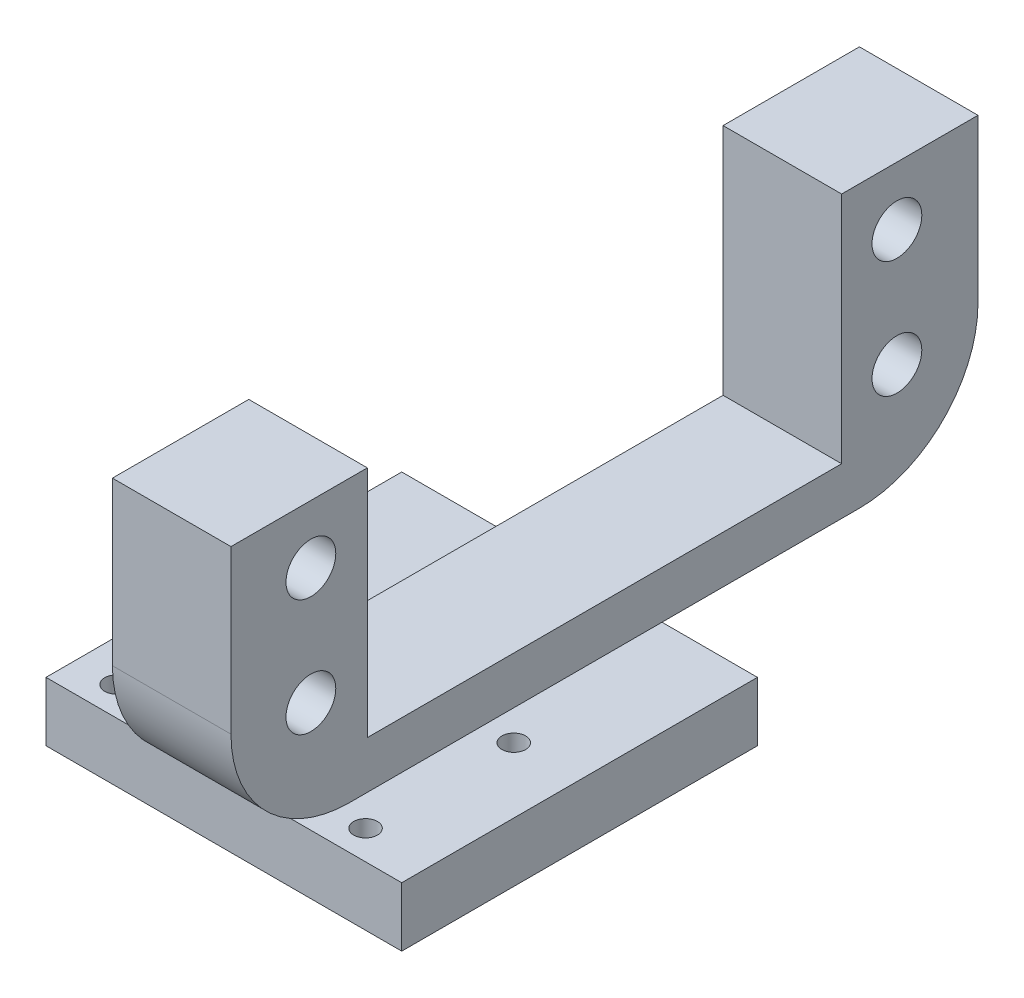
ISO-10303-21;
HEADER;
FILE_DESCRIPTION(('STEP AP214'),'2;1');
FILE_NAME('part.step','',(''),(''),'','','');
FILE_SCHEMA(('AUTOMOTIVE_DESIGN { 1 0 10303 214 1 1 1 1 }'));
ENDSEC;
DATA;
#1=APPLICATION_CONTEXT('core data for automotive mechanical design processes');
#2=APPLICATION_PROTOCOL_DEFINITION('international standard','automotive_design',2000,#1);
#3=PRODUCT_CONTEXT('',#1,'mechanical');
#4=PRODUCT('Part','Part','',(#3));
#5=PRODUCT_RELATED_PRODUCT_CATEGORY('part','',(#4));
#6=PRODUCT_DEFINITION_FORMATION('','',#4);
#7=PRODUCT_DEFINITION_CONTEXT('part definition',#1,'design');
#8=PRODUCT_DEFINITION('design','',#6,#7);
#9=PRODUCT_DEFINITION_SHAPE('','',#8);
#10=(LENGTH_UNIT() NAMED_UNIT(*) SI_UNIT(.MILLI.,.METRE.));
#11=(NAMED_UNIT(*) PLANE_ANGLE_UNIT() SI_UNIT($,.RADIAN.));
#12=(NAMED_UNIT(*) SI_UNIT($,.STERADIAN.) SOLID_ANGLE_UNIT());
#13=UNCERTAINTY_MEASURE_WITH_UNIT(LENGTH_MEASURE(1.E-05),#10,'distance_accuracy_value','');
#14=(GEOMETRIC_REPRESENTATION_CONTEXT(3) GLOBAL_UNCERTAINTY_ASSIGNED_CONTEXT((#13)) GLOBAL_UNIT_ASSIGNED_CONTEXT((#10,
#11,#12)) REPRESENTATION_CONTEXT('',''));
#15=CARTESIAN_POINT('',(0.,0.,0.));
#16=DIRECTION('',(0.,0.,1.));
#17=DIRECTION('',(1.,0.,0.));
#18=AXIS2_PLACEMENT_3D('',#15,#16,#17);
#19=CARTESIAN_POINT('',(10.,0.,0.));
#20=DIRECTION('',(0.,1.,0.));
#21=DIRECTION('',(0.,0.,1.));
#22=AXIS2_PLACEMENT_3D('',#19,#20,#21);
#23=PLANE('',#22);
#24=DIRECTION('',(1.,0.,0.));
#25=VECTOR('',#24,1.);
#26=CARTESIAN_POINT('',(18.0500000000001,0.,-36.35));
#27=LINE('',#26,#25);
#28=CARTESIAN_POINT('',(0.,0.,-36.35));
#29=VERTEX_POINT('',#28);
#30=CARTESIAN_POINT('',(10.,0.,-36.35));
#31=VERTEX_POINT('',#30);
#32=EDGE_CURVE('E59',#29,#31,#27,.T.);
#33=ORIENTED_EDGE('',*,*,#32,.F.);
#34=DIRECTION('',(0.,0.,-1.));
#35=VECTOR('',#34,1.);
#36=CARTESIAN_POINT('',(0.,0.,0.));
#37=LINE('',#36,#35);
#38=CARTESIAN_POINT('',(0.,0.,-53.));
#39=VERTEX_POINT('',#38);
#40=EDGE_CURVE('E221',#29,#39,#37,.T.);
#41=ORIENTED_EDGE('',*,*,#40,.T.);
#42=DIRECTION('',(-1.,0.,0.));
#43=VECTOR('',#42,1.);
#44=CARTESIAN_POINT('',(10.,0.,-53.));
#45=LINE('',#44,#43);
#46=CARTESIAN_POINT('',(10.,0.,-53.));
#47=VERTEX_POINT('',#46);
#48=EDGE_CURVE('E264',#39,#47,#45,.F.);
#49=ORIENTED_EDGE('',*,*,#48,.T.);
#50=DIRECTION('',(0.,0.,-1.));
#51=VECTOR('',#50,1.);
#52=CARTESIAN_POINT('',(10.,0.,0.));
#53=LINE('',#52,#51);
#54=EDGE_CURVE('E54',#31,#47,#53,.T.);
#55=ORIENTED_EDGE('',*,*,#54,.F.);
#56=EDGE_LOOP('',(#33,#41,#49,#55));
#57=FACE_BOUND('',#56,.T.);
#58=ADVANCED_FACE('F39',(#57),#23,.F.);
#59=CARTESIAN_POINT('',(10.,0.,0.));
#60=DIRECTION('',(0.,0.,-1.));
#61=DIRECTION('',(-1.,0.,0.));
#62=AXIS2_PLACEMENT_3D('',#59,#60,#61);
#63=PLANE('',#62);
#64=DIRECTION('',(0.,-1.,0.));
#65=VECTOR('',#64,1.);
#66=CARTESIAN_POINT('',(0.,0.,0.));
#67=LINE('',#66,#65);
#68=CARTESIAN_POINT('',(0.,23.7,0.));
#69=VERTEX_POINT('',#68);
#70=CARTESIAN_POINT('',(0.,10.,0.));
#71=VERTEX_POINT('',#70);
#72=EDGE_CURVE('E199',#69,#71,#67,.T.);
#73=ORIENTED_EDGE('',*,*,#72,.T.);
#74=DIRECTION('',(-1.,0.,0.));
#75=VECTOR('',#74,1.);
#76=CARTESIAN_POINT('',(10.,10.,0.));
#77=LINE('',#76,#75);
#78=CARTESIAN_POINT('',(10.,10.,0.));
#79=VERTEX_POINT('',#78);
#80=EDGE_CURVE('E11',#71,#79,#77,.F.);
#81=ORIENTED_EDGE('',*,*,#80,.T.);
#82=DIRECTION('',(0.,-1.,0.));
#83=VECTOR('',#82,1.);
#84=CARTESIAN_POINT('',(10.,0.,0.));
#85=LINE('',#84,#83);
#86=CARTESIAN_POINT('',(10.,23.7,0.));
#87=VERTEX_POINT('',#86);
#88=EDGE_CURVE('E200',#87,#79,#85,.T.);
#89=ORIENTED_EDGE('',*,*,#88,.F.);
#90=DIRECTION('',(-1.,0.,0.));
#91=VECTOR('',#90,1.);
#92=CARTESIAN_POINT('',(10.,23.7,0.));
#93=LINE('',#92,#91);
#94=EDGE_CURVE('E218',#87,#69,#93,.T.);
#95=ORIENTED_EDGE('',*,*,#94,.T.);
#96=EDGE_LOOP('',(#73,#81,#89,#95));
#97=FACE_BOUND('',#96,.T.);
#98=ADVANCED_FACE('F310',(#97),#63,.F.);
#99=CARTESIAN_POINT('',(10.,0.,-63.));
#100=DIRECTION('',(0.,0.,1.));
#101=DIRECTION('',(1.,0.,0.));
#102=AXIS2_PLACEMENT_3D('',#99,#100,#101);
#103=PLANE('',#102);
#104=DIRECTION('',(0.,1.,0.));
#105=VECTOR('',#104,1.);
#106=CARTESIAN_POINT('',(10.,0.,-63.));
#107=LINE('',#106,#105);
#108=CARTESIAN_POINT('',(10.,10.,-63.));
#109=VERTEX_POINT('',#108);
#110=CARTESIAN_POINT('',(10.,23.7,-63.));
#111=VERTEX_POINT('',#110);
#112=EDGE_CURVE('E206',#109,#111,#107,.T.);
#113=ORIENTED_EDGE('',*,*,#112,.F.);
#114=DIRECTION('',(-1.,0.,0.));
#115=VECTOR('',#114,1.);
#116=CARTESIAN_POINT('',(10.,10.,-63.));
#117=LINE('',#116,#115);
#118=CARTESIAN_POINT('',(0.,10.,-63.));
#119=VERTEX_POINT('',#118);
#120=EDGE_CURVE('E253',#109,#119,#117,.T.);
#121=ORIENTED_EDGE('',*,*,#120,.T.);
#122=DIRECTION('',(0.,1.,0.));
#123=VECTOR('',#122,1.);
#124=CARTESIAN_POINT('',(0.,0.,-63.));
#125=LINE('',#124,#123);
#126=CARTESIAN_POINT('',(0.,23.7,-63.));
#127=VERTEX_POINT('',#126);
#128=EDGE_CURVE('E225',#119,#127,#125,.T.);
#129=ORIENTED_EDGE('',*,*,#128,.T.);
#130=DIRECTION('',(-1.,0.,0.));
#131=VECTOR('',#130,1.);
#132=CARTESIAN_POINT('',(10.,23.7,-63.));
#133=LINE('',#132,#131);
#134=EDGE_CURVE('E250',#111,#127,#133,.T.);
#135=ORIENTED_EDGE('',*,*,#134,.F.);
#136=EDGE_LOOP('',(#113,#121,#129,#135));
#137=FACE_BOUND('',#136,.T.);
#138=ADVANCED_FACE('F276',(#137),#103,.F.);
#139=CARTESIAN_POINT('',(10.,23.7,-63.));
#140=DIRECTION('',(0.,-1.,0.));
#141=DIRECTION('',(0.,0.,-1.));
#142=AXIS2_PLACEMENT_3D('',#139,#140,#141);
#143=PLANE('',#142);
#144=DIRECTION('',(0.,0.,1.));
#145=VECTOR('',#144,1.);
#146=CARTESIAN_POINT('',(0.,23.7,-63.));
#147=LINE('',#146,#145);
#148=CARTESIAN_POINT('',(0.,23.7,-51.5));
#149=VERTEX_POINT('',#148);
#150=EDGE_CURVE('E227',#127,#149,#147,.T.);
#151=ORIENTED_EDGE('',*,*,#150,.T.);
#152=DIRECTION('',(-1.,0.,0.));
#153=VECTOR('',#152,1.);
#154=CARTESIAN_POINT('',(10.,23.7,-51.5));
#155=LINE('',#154,#153);
#156=CARTESIAN_POINT('',(10.,23.7,-51.5));
#157=VERTEX_POINT('',#156);
#158=EDGE_CURVE('E247',#157,#149,#155,.T.);
#159=ORIENTED_EDGE('',*,*,#158,.F.);
#160=DIRECTION('',(0.,0.,1.));
#161=VECTOR('',#160,1.);
#162=CARTESIAN_POINT('',(10.,23.7,-63.));
#163=LINE('',#162,#161);
#164=EDGE_CURVE('E208',#111,#157,#163,.T.);
#165=ORIENTED_EDGE('',*,*,#164,.F.);
#166=ORIENTED_EDGE('',*,*,#134,.T.);
#167=EDGE_LOOP('',(#151,#159,#165,#166));
#168=FACE_BOUND('',#167,.T.);
#169=ADVANCED_FACE('F285',(#168),#143,.F.);
#170=CARTESIAN_POINT('',(10.,23.7,-51.5));
#171=DIRECTION('',(0.,0.,-1.));
#172=DIRECTION('',(-1.,0.,0.));
#173=AXIS2_PLACEMENT_3D('',#170,#171,#172);
#174=PLANE('',#173);
#175=DIRECTION('',(0.,-1.,0.));
#176=VECTOR('',#175,1.);
#177=CARTESIAN_POINT('',(0.,23.7,-51.5));
#178=LINE('',#177,#176);
#179=CARTESIAN_POINT('',(0.,3.99999999999999,-51.5));
#180=VERTEX_POINT('',#179);
#181=EDGE_CURVE('E229',#149,#180,#178,.T.);
#182=ORIENTED_EDGE('',*,*,#181,.T.);
#183=DIRECTION('',(-1.,0.,0.));
#184=VECTOR('',#183,1.);
#185=CARTESIAN_POINT('',(10.,3.99999999999999,-51.5));
#186=LINE('',#185,#184);
#187=CARTESIAN_POINT('',(10.,3.99999999999999,-51.5));
#188=VERTEX_POINT('',#187);
#189=EDGE_CURVE('E244',#188,#180,#186,.T.);
#190=ORIENTED_EDGE('',*,*,#189,.F.);
#191=DIRECTION('',(0.,-1.,0.));
#192=VECTOR('',#191,1.);
#193=CARTESIAN_POINT('',(10.,23.7,-51.5));
#194=LINE('',#193,#192);
#195=EDGE_CURVE('E210',#157,#188,#194,.T.);
#196=ORIENTED_EDGE('',*,*,#195,.F.);
#197=ORIENTED_EDGE('',*,*,#158,.T.);
#198=EDGE_LOOP('',(#182,#190,#196,#197));
#199=FACE_BOUND('',#198,.T.);
#200=ADVANCED_FACE('F292',(#199),#174,.F.);
#201=CARTESIAN_POINT('',(10.,3.99999999999999,-51.5));
#202=DIRECTION('',(0.,-1.,0.));
#203=DIRECTION('',(0.,0.,-1.));
#204=AXIS2_PLACEMENT_3D('',#201,#202,#203);
#205=PLANE('',#204);
#206=DIRECTION('',(0.,0.,1.));
#207=VECTOR('',#206,1.);
#208=CARTESIAN_POINT('',(0.,3.99999999999999,-51.5));
#209=LINE('',#208,#207);
#210=CARTESIAN_POINT('',(0.,3.99999999999999,-11.5));
#211=VERTEX_POINT('',#210);
#212=EDGE_CURVE('E231',#180,#211,#209,.T.);
#213=ORIENTED_EDGE('',*,*,#212,.T.);
#214=DIRECTION('',(-1.,0.,0.));
#215=VECTOR('',#214,1.);
#216=CARTESIAN_POINT('',(10.,3.99999999999999,-11.5));
#217=LINE('',#216,#215);
#218=CARTESIAN_POINT('',(10.,3.99999999999999,-11.5));
#219=VERTEX_POINT('',#218);
#220=EDGE_CURVE('E241',#219,#211,#217,.T.);
#221=ORIENTED_EDGE('',*,*,#220,.F.);
#222=DIRECTION('',(0.,0.,1.));
#223=VECTOR('',#222,1.);
#224=CARTESIAN_POINT('',(10.,3.99999999999999,-51.5));
#225=LINE('',#224,#223);
#226=EDGE_CURVE('E212',#188,#219,#225,.T.);
#227=ORIENTED_EDGE('',*,*,#226,.F.);
#228=ORIENTED_EDGE('',*,*,#189,.T.);
#229=EDGE_LOOP('',(#213,#221,#227,#228));
#230=FACE_BOUND('',#229,.T.);
#231=ADVANCED_FACE('F295',(#230),#205,.F.);
#232=CARTESIAN_POINT('',(10.,23.7,-11.5));
#233=DIRECTION('',(0.,0.,1.));
#234=DIRECTION('',(1.,0.,0.));
#235=AXIS2_PLACEMENT_3D('',#232,#233,#234);
#236=PLANE('',#235);
#237=DIRECTION('',(0.,1.,0.));
#238=VECTOR('',#237,1.);
#239=CARTESIAN_POINT('',(0.,23.7,-11.5));
#240=LINE('',#239,#238);
#241=CARTESIAN_POINT('',(0.,23.7,-11.5));
#242=VERTEX_POINT('',#241);
#243=EDGE_CURVE('E233',#211,#242,#240,.T.);
#244=ORIENTED_EDGE('',*,*,#243,.T.);
#245=DIRECTION('',(-1.,0.,0.));
#246=VECTOR('',#245,1.);
#247=CARTESIAN_POINT('',(10.,23.7,-11.5));
#248=LINE('',#247,#246);
#249=CARTESIAN_POINT('',(10.,23.7,-11.5));
#250=VERTEX_POINT('',#249);
#251=EDGE_CURVE('E238',#250,#242,#248,.T.);
#252=ORIENTED_EDGE('',*,*,#251,.F.);
#253=DIRECTION('',(0.,1.,0.));
#254=VECTOR('',#253,1.);
#255=CARTESIAN_POINT('',(10.,23.7,-11.5));
#256=LINE('',#255,#254);
#257=EDGE_CURVE('E214',#219,#250,#256,.T.);
#258=ORIENTED_EDGE('',*,*,#257,.F.);
#259=ORIENTED_EDGE('',*,*,#220,.T.);
#260=EDGE_LOOP('',(#244,#252,#258,#259));
#261=FACE_BOUND('',#260,.T.);
#262=ADVANCED_FACE('F300',(#261),#236,.F.);
#263=CARTESIAN_POINT('',(10.,23.7,0.));
#264=DIRECTION('',(0.,-1.,0.));
#265=DIRECTION('',(0.,0.,-1.));
#266=AXIS2_PLACEMENT_3D('',#263,#264,#265);
#267=PLANE('',#266);
#268=DIRECTION('',(0.,0.,1.));
#269=VECTOR('',#268,1.);
#270=CARTESIAN_POINT('',(0.,23.7,0.));
#271=LINE('',#270,#269);
#272=EDGE_CURVE('E203',#242,#69,#271,.T.);
#273=ORIENTED_EDGE('',*,*,#272,.T.);
#274=ORIENTED_EDGE('',*,*,#94,.F.);
#275=DIRECTION('',(0.,0.,1.));
#276=VECTOR('',#275,1.);
#277=CARTESIAN_POINT('',(10.,23.7,0.));
#278=LINE('',#277,#276);
#279=EDGE_CURVE('E216',#250,#87,#278,.T.);
#280=ORIENTED_EDGE('',*,*,#279,.F.);
#281=ORIENTED_EDGE('',*,*,#251,.T.);
#282=EDGE_LOOP('',(#273,#274,#280,#281));
#283=FACE_BOUND('',#282,.T.);
#284=ADVANCED_FACE('F306',(#283),#267,.F.);
#285=CARTESIAN_POINT('',(10.,0.,0.));
#286=DIRECTION('',(-1.,0.,0.));
#287=DIRECTION('',(0.,0.,1.));
#288=AXIS2_PLACEMENT_3D('',#285,#286,#287);
#289=PLANE('',#288);
#290=CARTESIAN_POINT('',(10.,8.92500000000044,-6.73885438200013));
#291=DIRECTION('',(1.,0.,0.));
#292=DIRECTION('',(0.,0.,-1.));
#293=AXIS2_PLACEMENT_3D('',#290,#291,#292);
#294=CIRCLE('',#293,2.10000000000001);
#295=CARTESIAN_POINT('',(10.,8.92500000000044,-8.83885438200014));
#296=VERTEX_POINT('',#295);
#297=EDGE_CURVE('E170',#296,#296,#294,.T.);
#298=ORIENTED_EDGE('',*,*,#297,.F.);
#299=EDGE_LOOP('',(#298));
#300=FACE_BOUND('',#299,.T.);
#301=CARTESIAN_POINT('',(10.,8.92500000000028,-56.1611456180004));
#302=DIRECTION('',(1.,0.,0.));
#303=DIRECTION('',(0.,0.,-1.));
#304=AXIS2_PLACEMENT_3D('',#301,#302,#303);
#305=CIRCLE('',#304,2.10000000000001);
#306=CARTESIAN_POINT('',(10.,8.92500000000028,-58.2611456180004));
#307=VERTEX_POINT('',#306);
#308=EDGE_CURVE('E187',#307,#307,#305,.T.);
#309=ORIENTED_EDGE('',*,*,#308,.F.);
#310=EDGE_LOOP('',(#309));
#311=FACE_BOUND('',#310,.T.);
#312=CARTESIAN_POINT('',(10.,18.7750000000003,-56.1611456180005));
#313=DIRECTION('',(1.,0.,0.));
#314=DIRECTION('',(0.,0.,-1.));
#315=AXIS2_PLACEMENT_3D('',#312,#313,#314);
#316=CIRCLE('',#315,2.10000000000001);
#317=CARTESIAN_POINT('',(10.,18.7750000000003,-58.2611456180005));
#318=VERTEX_POINT('',#317);
#319=EDGE_CURVE('E179',#318,#318,#316,.T.);
#320=ORIENTED_EDGE('',*,*,#319,.F.);
#321=EDGE_LOOP('',(#320));
#322=FACE_BOUND('',#321,.T.);
#323=CARTESIAN_POINT('',(10.,18.7750000000004,-6.73885438200017));
#324=DIRECTION('',(1.,0.,0.));
#325=DIRECTION('',(0.,0.,-1.));
#326=AXIS2_PLACEMENT_3D('',#323,#324,#325);
#327=CIRCLE('',#326,2.10000000000001);
#328=CARTESIAN_POINT('',(10.,18.7750000000004,-8.83885438200018));
#329=VERTEX_POINT('',#328);
#330=EDGE_CURVE('E186',#329,#329,#327,.T.);
#331=ORIENTED_EDGE('',*,*,#330,.F.);
#332=EDGE_LOOP('',(#331));
#333=FACE_BOUND('',#332,.T.);
#334=CARTESIAN_POINT('',(10.,0.,-10.));
#335=VERTEX_POINT('',#334);
#336=EDGE_CURVE('E204',#335,#31,#53,.T.);
#337=ORIENTED_EDGE('',*,*,#336,.T.);
#338=ORIENTED_EDGE('',*,*,#54,.T.);
#339=CARTESIAN_POINT('',(10.,10.,-53.));
#340=DIRECTION('',(-1.,0.,0.));
#341=DIRECTION('',(0.,0.,1.));
#342=AXIS2_PLACEMENT_3D('',#339,#340,#341);
#343=CIRCLE('',#342,10.);
#344=EDGE_CURVE('E47',#47,#109,#343,.F.);
#345=ORIENTED_EDGE('',*,*,#344,.T.);
#346=ORIENTED_EDGE('',*,*,#112,.T.);
#347=ORIENTED_EDGE('',*,*,#164,.T.);
#348=ORIENTED_EDGE('',*,*,#195,.T.);
#349=ORIENTED_EDGE('',*,*,#226,.T.);
#350=ORIENTED_EDGE('',*,*,#257,.T.);
#351=ORIENTED_EDGE('',*,*,#279,.T.);
#352=ORIENTED_EDGE('',*,*,#88,.T.);
#353=CARTESIAN_POINT('',(10.,10.,-10.));
#354=DIRECTION('',(-1.,0.,0.));
#355=DIRECTION('',(0.,0.,1.));
#356=AXIS2_PLACEMENT_3D('',#353,#354,#355);
#357=CIRCLE('',#356,10.);
#358=EDGE_CURVE('E266',#79,#335,#357,.F.);
#359=ORIENTED_EDGE('',*,*,#358,.T.);
#360=EDGE_LOOP('',(#337,#338,#345,#346,#347,#348,#349,#350,#351,#352,#359));
#361=FACE_BOUND('',#360,.T.);
#362=ADVANCED_FACE('F270',(#300,#311,#322,#333,#361),#289,.F.);
#363=CARTESIAN_POINT('',(0.,0.,0.));
#364=DIRECTION('',(-1.,0.,0.));
#365=DIRECTION('',(0.,0.,1.));
#366=AXIS2_PLACEMENT_3D('',#363,#364,#365);
#367=PLANE('',#366);
#368=CARTESIAN_POINT('',(0.,8.92500000000044,-6.73885438200013));
#369=DIRECTION('',(-1.,0.,0.));
#370=DIRECTION('',(0.,0.,1.));
#371=AXIS2_PLACEMENT_3D('',#368,#369,#370);
#372=CIRCLE('',#371,2.10000000000001);
#373=CARTESIAN_POINT('',(0.,8.92500000000044,-4.63885438200012));
#374=VERTEX_POINT('',#373);
#375=EDGE_CURVE('E173',#374,#374,#372,.F.);
#376=ORIENTED_EDGE('',*,*,#375,.T.);
#377=EDGE_LOOP('',(#376));
#378=FACE_BOUND('',#377,.T.);
#379=CARTESIAN_POINT('',(0.,8.92500000000028,-56.1611456180004));
#380=DIRECTION('',(-1.,0.,0.));
#381=DIRECTION('',(0.,0.,1.));
#382=AXIS2_PLACEMENT_3D('',#379,#380,#381);
#383=CIRCLE('',#382,2.10000000000001);
#384=CARTESIAN_POINT('',(0.,8.92500000000028,-54.0611456180004));
#385=VERTEX_POINT('',#384);
#386=EDGE_CURVE('E183',#385,#385,#383,.F.);
#387=ORIENTED_EDGE('',*,*,#386,.T.);
#388=EDGE_LOOP('',(#387));
#389=FACE_BOUND('',#388,.T.);
#390=CARTESIAN_POINT('',(0.,18.7750000000003,-56.1611456180005));
#391=DIRECTION('',(-1.,0.,0.));
#392=DIRECTION('',(0.,0.,1.));
#393=AXIS2_PLACEMENT_3D('',#390,#391,#392);
#394=CIRCLE('',#393,2.10000000000001);
#395=CARTESIAN_POINT('',(0.,18.7750000000003,-54.0611456180005));
#396=VERTEX_POINT('',#395);
#397=EDGE_CURVE('E182',#396,#396,#394,.F.);
#398=ORIENTED_EDGE('',*,*,#397,.T.);
#399=EDGE_LOOP('',(#398));
#400=FACE_BOUND('',#399,.T.);
#401=CARTESIAN_POINT('',(0.,18.7750000000004,-6.73885438200017));
#402=DIRECTION('',(-1.,0.,0.));
#403=DIRECTION('',(0.,0.,1.));
#404=AXIS2_PLACEMENT_3D('',#401,#402,#403);
#405=CIRCLE('',#404,2.10000000000001);
#406=CARTESIAN_POINT('',(0.,18.7750000000004,-4.63885438200016));
#407=VERTEX_POINT('',#406);
#408=EDGE_CURVE('E196',#407,#407,#405,.F.);
#409=ORIENTED_EDGE('',*,*,#408,.T.);
#410=EDGE_LOOP('',(#409));
#411=FACE_BOUND('',#410,.T.);
#412=ORIENTED_EDGE('',*,*,#128,.F.);
#413=CARTESIAN_POINT('',(0.,10.,-53.));
#414=DIRECTION('',(-1.,0.,0.));
#415=DIRECTION('',(0.,0.,1.));
#416=AXIS2_PLACEMENT_3D('',#413,#414,#415);
#417=CIRCLE('',#416,10.);
#418=EDGE_CURVE('E258',#119,#39,#417,.T.);
#419=ORIENTED_EDGE('',*,*,#418,.T.);
#420=ORIENTED_EDGE('',*,*,#40,.F.);
#421=CARTESIAN_POINT('',(0.,0.,-10.));
#422=VERTEX_POINT('',#421);
#423=EDGE_CURVE('E222',#422,#29,#37,.T.);
#424=ORIENTED_EDGE('',*,*,#423,.F.);
#425=CARTESIAN_POINT('',(0.,10.,-10.));
#426=DIRECTION('',(-1.,0.,0.));
#427=DIRECTION('',(0.,0.,1.));
#428=AXIS2_PLACEMENT_3D('',#425,#426,#427);
#429=CIRCLE('',#428,10.);
#430=EDGE_CURVE('E256',#422,#71,#429,.T.);
#431=ORIENTED_EDGE('',*,*,#430,.T.);
#432=ORIENTED_EDGE('',*,*,#72,.F.);
#433=ORIENTED_EDGE('',*,*,#272,.F.);
#434=ORIENTED_EDGE('',*,*,#243,.F.);
#435=ORIENTED_EDGE('',*,*,#212,.F.);
#436=ORIENTED_EDGE('',*,*,#181,.F.);
#437=ORIENTED_EDGE('',*,*,#150,.F.);
#438=EDGE_LOOP('',(#412,#419,#420,#424,#431,#432,#433,#434,#435,#436,#437));
#439=FACE_BOUND('',#438,.T.);
#440=ADVANCED_FACE('F281',(#378,#389,#400,#411,#439),#367,.T.);
#441=CARTESIAN_POINT('',(-5.93969696196703,18.7750000000004,-6.73885438200017));
#442=DIRECTION('',(1.,0.,0.));
#443=DIRECTION('',(0.,0.,-1.));
#444=AXIS2_PLACEMENT_3D('',#441,#442,#443);
#445=CYLINDRICAL_SURFACE('',#444,2.10000000000001);
#446=ORIENTED_EDGE('',*,*,#330,.T.);
#447=EDGE_LOOP('',(#446));
#448=FACE_BOUND('',#447,.T.);
#449=ORIENTED_EDGE('',*,*,#408,.F.);
#450=EDGE_LOOP('',(#449));
#451=FACE_BOUND('',#450,.T.);
#452=ADVANCED_FACE('F382',(#448,#451),#445,.F.);
#453=CARTESIAN_POINT('',(-5.93969696196703,18.7750000000003,-56.1611456180005));
#454=DIRECTION('',(1.,0.,0.));
#455=DIRECTION('',(0.,0.,-1.));
#456=AXIS2_PLACEMENT_3D('',#453,#454,#455);
#457=CYLINDRICAL_SURFACE('',#456,2.10000000000001);
#458=ORIENTED_EDGE('',*,*,#319,.T.);
#459=EDGE_LOOP('',(#458));
#460=FACE_BOUND('',#459,.T.);
#461=ORIENTED_EDGE('',*,*,#397,.F.);
#462=EDGE_LOOP('',(#461));
#463=FACE_BOUND('',#462,.T.);
#464=ADVANCED_FACE('F376',(#460,#463),#457,.F.);
#465=CARTESIAN_POINT('',(-5.93969696196703,8.92500000000028,-56.1611456180004));
#466=DIRECTION('',(1.,0.,0.));
#467=DIRECTION('',(0.,0.,-1.));
#468=AXIS2_PLACEMENT_3D('',#465,#466,#467);
#469=CYLINDRICAL_SURFACE('',#468,2.10000000000001);
#470=ORIENTED_EDGE('',*,*,#308,.T.);
#471=EDGE_LOOP('',(#470));
#472=FACE_BOUND('',#471,.T.);
#473=ORIENTED_EDGE('',*,*,#386,.F.);
#474=EDGE_LOOP('',(#473));
#475=FACE_BOUND('',#474,.T.);
#476=ADVANCED_FACE('F370',(#472,#475),#469,.F.);
#477=CARTESIAN_POINT('',(-5.93969696196703,8.92500000000044,-6.73885438200013));
#478=DIRECTION('',(1.,0.,0.));
#479=DIRECTION('',(0.,0.,-1.));
#480=AXIS2_PLACEMENT_3D('',#477,#478,#479);
#481=CYLINDRICAL_SURFACE('',#480,2.10000000000001);
#482=ORIENTED_EDGE('',*,*,#297,.T.);
#483=EDGE_LOOP('',(#482));
#484=FACE_BOUND('',#483,.T.);
#485=ORIENTED_EDGE('',*,*,#375,.F.);
#486=EDGE_LOOP('',(#485));
#487=FACE_BOUND('',#486,.T.);
#488=ADVANCED_FACE('F365',(#484,#487),#481,.F.);
#489=CARTESIAN_POINT('',(10.,10.,-53.));
#490=DIRECTION('',(-1.,0.,0.));
#491=DIRECTION('',(0.,0.,1.));
#492=AXIS2_PLACEMENT_3D('',#489,#490,#491);
#493=CYLINDRICAL_SURFACE('',#492,10.);
#494=ORIENTED_EDGE('',*,*,#344,.F.);
#495=ORIENTED_EDGE('',*,*,#48,.F.);
#496=ORIENTED_EDGE('',*,*,#418,.F.);
#497=ORIENTED_EDGE('',*,*,#120,.F.);
#498=EDGE_LOOP('',(#494,#495,#496,#497));
#499=FACE_BOUND('',#498,.T.);
#500=ADVANCED_FACE('F279',(#499),#493,.T.);
#501=CARTESIAN_POINT('',(10.,10.,-10.));
#502=DIRECTION('',(-1.,0.,0.));
#503=DIRECTION('',(0.,0.,1.));
#504=AXIS2_PLACEMENT_3D('',#501,#502,#503);
#505=CYLINDRICAL_SURFACE('',#504,10.);
#506=ORIENTED_EDGE('',*,*,#358,.F.);
#507=ORIENTED_EDGE('',*,*,#80,.F.);
#508=ORIENTED_EDGE('',*,*,#430,.F.);
#509=DIRECTION('',(-1.,0.,0.));
#510=VECTOR('',#509,1.);
#511=CARTESIAN_POINT('',(10.,0.,-10.));
#512=LINE('',#511,#510);
#513=EDGE_CURVE('E261',#335,#422,#512,.T.);
#514=ORIENTED_EDGE('',*,*,#513,.F.);
#515=EDGE_LOOP('',(#506,#507,#508,#514));
#516=FACE_BOUND('',#515,.T.);
#517=ADVANCED_FACE('F41',(#516),#505,.T.);
#518=CARTESIAN_POINT('',(0.,0.,0.));
#519=DIRECTION('',(0.,1.,0.));
#520=DIRECTION('',(0.,0.,1.));
#521=AXIS2_PLACEMENT_3D('',#518,#519,#520);
#522=PLANE('',#521);
#523=CARTESIAN_POINT('',(-8.45000000000018,0.,-21.3));
#524=DIRECTION('',(0.,1.,0.));
#525=DIRECTION('',(0.,0.,1.));
#526=AXIS2_PLACEMENT_3D('',#523,#524,#525);
#527=CIRCLE('',#526,0.999999999999999);
#528=CARTESIAN_POINT('',(-8.45000000000018,0.,-20.3));
#529=VERTEX_POINT('',#528);
#530=EDGE_CURVE('E573',#529,#529,#527,.F.);
#531=ORIENTED_EDGE('',*,*,#530,.T.);
#532=EDGE_LOOP('',(#531));
#533=FACE_BOUND('',#532,.T.);
#534=CARTESIAN_POINT('',(12.5499999999998,0.,-21.3));
#535=DIRECTION('',(0.,1.,0.));
#536=DIRECTION('',(0.,0.,1.));
#537=AXIS2_PLACEMENT_3D('',#534,#535,#536);
#538=CIRCLE('',#537,1.);
#539=CARTESIAN_POINT('',(12.5499999999998,0.,-20.3));
#540=VERTEX_POINT('',#539);
#541=EDGE_CURVE('E576',#540,#540,#538,.F.);
#542=ORIENTED_EDGE('',*,*,#541,.T.);
#543=EDGE_LOOP('',(#542));
#544=FACE_BOUND('',#543,.T.);
#545=CARTESIAN_POINT('',(12.5499999999998,0.,-8.79999999999998));
#546=DIRECTION('',(0.,1.,0.));
#547=DIRECTION('',(0.,0.,1.));
#548=AXIS2_PLACEMENT_3D('',#545,#546,#547);
#549=CIRCLE('',#548,1.);
#550=CARTESIAN_POINT('',(12.5499999999998,0.,-7.79999999999998));
#551=VERTEX_POINT('',#550);
#552=EDGE_CURVE('E343',#551,#551,#549,.F.);
#553=ORIENTED_EDGE('',*,*,#552,.T.);
#554=EDGE_LOOP('',(#553));
#555=FACE_BOUND('',#554,.T.);
#556=CARTESIAN_POINT('',(-8.45000000000018,0.,-8.79999999999998));
#557=DIRECTION('',(0.,1.,0.));
#558=DIRECTION('',(0.,0.,1.));
#559=AXIS2_PLACEMENT_3D('',#556,#557,#558);
#560=CIRCLE('',#559,0.999999999999999);
#561=CARTESIAN_POINT('',(-8.45000000000018,0.,-7.79999999999999));
#562=VERTEX_POINT('',#561);
#563=EDGE_CURVE('E336',#562,#562,#560,.F.);
#564=ORIENTED_EDGE('',*,*,#563,.T.);
#565=EDGE_LOOP('',(#564));
#566=FACE_BOUND('',#565,.T.);
#567=ORIENTED_EDGE('',*,*,#336,.F.);
#568=ORIENTED_EDGE('',*,*,#513,.T.);
#569=ORIENTED_EDGE('',*,*,#423,.T.);
#570=CARTESIAN_POINT('',(-11.9499999999999,0.,-36.35));
#571=VERTEX_POINT('',#570);
#572=EDGE_CURVE('E324',#571,#29,#27,.T.);
#573=ORIENTED_EDGE('',*,*,#572,.F.);
#574=DIRECTION('',(0.,0.,-1.));
#575=VECTOR('',#574,1.);
#576=CARTESIAN_POINT('',(-11.9499999999999,0.,-6.34999999999997));
#577=LINE('',#576,#575);
#578=CARTESIAN_POINT('',(-11.9499999999999,0.,-6.34999999999997));
#579=VERTEX_POINT('',#578);
#580=EDGE_CURVE('E169',#579,#571,#577,.T.);
#581=ORIENTED_EDGE('',*,*,#580,.F.);
#582=DIRECTION('',(-1.,0.,0.));
#583=VECTOR('',#582,1.);
#584=CARTESIAN_POINT('',(18.0500000000001,0.,-6.34999999999997));
#585=LINE('',#584,#583);
#586=CARTESIAN_POINT('',(18.0500000000001,0.,-6.34999999999997));
#587=VERTEX_POINT('',#586);
#588=EDGE_CURVE('E165',#587,#579,#585,.T.);
#589=ORIENTED_EDGE('',*,*,#588,.F.);
#590=DIRECTION('',(0.,0.,1.));
#591=VECTOR('',#590,1.);
#592=CARTESIAN_POINT('',(18.0500000000001,0.,-6.34999999999997));
#593=LINE('',#592,#591);
#594=CARTESIAN_POINT('',(18.0500000000001,0.,-36.35));
#595=VERTEX_POINT('',#594);
#596=EDGE_CURVE('E322',#595,#587,#593,.T.);
#597=ORIENTED_EDGE('',*,*,#596,.F.);
#598=EDGE_CURVE('E319',#31,#595,#27,.T.);
#599=ORIENTED_EDGE('',*,*,#598,.F.);
#600=EDGE_LOOP('',(#567,#568,#569,#573,#581,#589,#597,#599));
#601=FACE_BOUND('',#600,.T.);
#602=ADVANCED_FACE('F320',(#533,#544,#555,#566,#601),#522,.T.);
#603=CARTESIAN_POINT('',(-11.9499999999999,-5.,-6.34999999999997));
#604=DIRECTION('',(1.,0.,0.));
#605=DIRECTION('',(0.,0.,-1.));
#606=AXIS2_PLACEMENT_3D('',#603,#604,#605);
#607=PLANE('',#606);
#608=ORIENTED_EDGE('',*,*,#580,.T.);
#609=DIRECTION('',(0.,1.,0.));
#610=VECTOR('',#609,1.);
#611=CARTESIAN_POINT('',(-11.9499999999999,-5.,-36.35));
#612=LINE('',#611,#610);
#613=CARTESIAN_POINT('',(-11.9499999999999,-5.,-36.35));
#614=VERTEX_POINT('',#613);
#615=EDGE_CURVE('E149',#614,#571,#612,.T.);
#616=ORIENTED_EDGE('',*,*,#615,.F.);
#617=DIRECTION('',(0.,0.,-1.));
#618=VECTOR('',#617,1.);
#619=CARTESIAN_POINT('',(-11.9499999999999,-5.,-6.34999999999997));
#620=LINE('',#619,#618);
#621=CARTESIAN_POINT('',(-11.9499999999999,-5.,-6.34999999999997));
#622=VERTEX_POINT('',#621);
#623=EDGE_CURVE('E156',#622,#614,#620,.T.);
#624=ORIENTED_EDGE('',*,*,#623,.F.);
#625=DIRECTION('',(0.,1.,0.));
#626=VECTOR('',#625,1.);
#627=CARTESIAN_POINT('',(-11.9499999999999,-5.,-6.34999999999997));
#628=LINE('',#627,#626);
#629=EDGE_CURVE('E330',#622,#579,#628,.T.);
#630=ORIENTED_EDGE('',*,*,#629,.T.);
#631=EDGE_LOOP('',(#608,#616,#624,#630));
#632=FACE_BOUND('',#631,.T.);
#633=ADVANCED_FACE('F167',(#632),#607,.F.);
#634=CARTESIAN_POINT('',(18.0500000000001,-5.,-36.35));
#635=DIRECTION('',(0.,0.,1.));
#636=DIRECTION('',(1.,0.,0.));
#637=AXIS2_PLACEMENT_3D('',#634,#635,#636);
#638=PLANE('',#637);
#639=ORIENTED_EDGE('',*,*,#572,.T.);
#640=ORIENTED_EDGE('',*,*,#32,.T.);
#641=ORIENTED_EDGE('',*,*,#598,.T.);
#642=DIRECTION('',(0.,1.,0.));
#643=VECTOR('',#642,1.);
#644=CARTESIAN_POINT('',(18.0500000000001,-5.,-36.35));
#645=LINE('',#644,#643);
#646=CARTESIAN_POINT('',(18.0500000000001,-5.,-36.35));
#647=VERTEX_POINT('',#646);
#648=EDGE_CURVE('E152',#647,#595,#645,.T.);
#649=ORIENTED_EDGE('',*,*,#648,.F.);
#650=DIRECTION('',(1.,0.,0.));
#651=VECTOR('',#650,1.);
#652=CARTESIAN_POINT('',(18.0500000000001,-5.,-36.35));
#653=LINE('',#652,#651);
#654=EDGE_CURVE('E144',#614,#647,#653,.T.);
#655=ORIENTED_EDGE('',*,*,#654,.F.);
#656=ORIENTED_EDGE('',*,*,#615,.T.);
#657=EDGE_LOOP('',(#639,#640,#641,#649,#655,#656));
#658=FACE_BOUND('',#657,.T.);
#659=ADVANCED_FACE('F147',(#658),#638,.F.);
#660=CARTESIAN_POINT('',(18.0500000000001,-5.,-6.34999999999997));
#661=DIRECTION('',(-1.,0.,0.));
#662=DIRECTION('',(0.,0.,1.));
#663=AXIS2_PLACEMENT_3D('',#660,#661,#662);
#664=PLANE('',#663);
#665=ORIENTED_EDGE('',*,*,#596,.T.);
#666=DIRECTION('',(0.,1.,0.));
#667=VECTOR('',#666,1.);
#668=CARTESIAN_POINT('',(18.0500000000001,-5.,-6.34999999999997));
#669=LINE('',#668,#667);
#670=CARTESIAN_POINT('',(18.0500000000001,-5.,-6.34999999999997));
#671=VERTEX_POINT('',#670);
#672=EDGE_CURVE('E175',#671,#587,#669,.T.);
#673=ORIENTED_EDGE('',*,*,#672,.F.);
#674=DIRECTION('',(0.,0.,1.));
#675=VECTOR('',#674,1.);
#676=CARTESIAN_POINT('',(18.0500000000001,-5.,-6.34999999999997));
#677=LINE('',#676,#675);
#678=EDGE_CURVE('E155',#647,#671,#677,.T.);
#679=ORIENTED_EDGE('',*,*,#678,.F.);
#680=ORIENTED_EDGE('',*,*,#648,.T.);
#681=EDGE_LOOP('',(#665,#673,#679,#680));
#682=FACE_BOUND('',#681,.T.);
#683=ADVANCED_FACE('F347',(#682),#664,.F.);
#684=CARTESIAN_POINT('',(18.0500000000001,-5.,-6.34999999999997));
#685=DIRECTION('',(0.,0.,-1.));
#686=DIRECTION('',(-1.,0.,0.));
#687=AXIS2_PLACEMENT_3D('',#684,#685,#686);
#688=PLANE('',#687);
#689=ORIENTED_EDGE('',*,*,#588,.T.);
#690=ORIENTED_EDGE('',*,*,#629,.F.);
#691=DIRECTION('',(-1.,0.,0.));
#692=VECTOR('',#691,1.);
#693=CARTESIAN_POINT('',(18.0500000000001,-5.,-6.34999999999997));
#694=LINE('',#693,#692);
#695=EDGE_CURVE('E161',#671,#622,#694,.T.);
#696=ORIENTED_EDGE('',*,*,#695,.F.);
#697=ORIENTED_EDGE('',*,*,#672,.T.);
#698=EDGE_LOOP('',(#689,#690,#696,#697));
#699=FACE_BOUND('',#698,.T.);
#700=ADVANCED_FACE('F334',(#699),#688,.F.);
#701=CARTESIAN_POINT('',(0.,-5.,0.));
#702=DIRECTION('',(0.,1.,0.));
#703=DIRECTION('',(0.,0.,1.));
#704=AXIS2_PLACEMENT_3D('',#701,#702,#703);
#705=PLANE('',#704);
#706=CARTESIAN_POINT('',(-8.45000000000018,-5.,-21.3));
#707=DIRECTION('',(0.,-1.,0.));
#708=DIRECTION('',(0.,0.,-1.));
#709=AXIS2_PLACEMENT_3D('',#706,#707,#708);
#710=CIRCLE('',#709,0.999999999999999);
#711=CARTESIAN_POINT('',(-8.45000000000018,-5.,-22.3));
#712=VERTEX_POINT('',#711);
#713=EDGE_CURVE('E570',#712,#712,#710,.T.);
#714=ORIENTED_EDGE('',*,*,#713,.F.);
#715=EDGE_LOOP('',(#714));
#716=FACE_BOUND('',#715,.T.);
#717=CARTESIAN_POINT('',(12.5499999999998,-5.,-21.3));
#718=DIRECTION('',(0.,-1.,0.));
#719=DIRECTION('',(0.,0.,-1.));
#720=AXIS2_PLACEMENT_3D('',#717,#718,#719);
#721=CIRCLE('',#720,1.);
#722=CARTESIAN_POINT('',(12.5499999999998,-5.,-22.3));
#723=VERTEX_POINT('',#722);
#724=EDGE_CURVE('E574',#723,#723,#721,.T.);
#725=ORIENTED_EDGE('',*,*,#724,.F.);
#726=EDGE_LOOP('',(#725));
#727=FACE_BOUND('',#726,.T.);
#728=CARTESIAN_POINT('',(12.5499999999998,-5.,-8.79999999999998));
#729=DIRECTION('',(0.,-1.,0.));
#730=DIRECTION('',(0.,0.,-1.));
#731=AXIS2_PLACEMENT_3D('',#728,#729,#730);
#732=CIRCLE('',#731,1.);
#733=CARTESIAN_POINT('',(12.5499999999998,-5.,-9.79999999999999));
#734=VERTEX_POINT('',#733);
#735=EDGE_CURVE('E581',#734,#734,#732,.T.);
#736=ORIENTED_EDGE('',*,*,#735,.F.);
#737=EDGE_LOOP('',(#736));
#738=FACE_BOUND('',#737,.T.);
#739=CARTESIAN_POINT('',(-8.45000000000018,-5.,-8.79999999999998));
#740=DIRECTION('',(0.,-1.,0.));
#741=DIRECTION('',(0.,0.,-1.));
#742=AXIS2_PLACEMENT_3D('',#739,#740,#741);
#743=CIRCLE('',#742,0.999999999999999);
#744=CARTESIAN_POINT('',(-8.45000000000018,-5.,-9.79999999999998));
#745=VERTEX_POINT('',#744);
#746=EDGE_CURVE('E338',#745,#745,#743,.T.);
#747=ORIENTED_EDGE('',*,*,#746,.F.);
#748=EDGE_LOOP('',(#747));
#749=FACE_BOUND('',#748,.T.);
#750=ORIENTED_EDGE('',*,*,#623,.T.);
#751=ORIENTED_EDGE('',*,*,#654,.T.);
#752=ORIENTED_EDGE('',*,*,#678,.T.);
#753=ORIENTED_EDGE('',*,*,#695,.T.);
#754=EDGE_LOOP('',(#750,#751,#752,#753));
#755=FACE_BOUND('',#754,.T.);
#756=ADVANCED_FACE('F159',(#716,#727,#738,#749,#755),#705,.F.);
#757=CARTESIAN_POINT('',(-8.45000000000018,2.82842712474619,-8.79999999999998));
#758=DIRECTION('',(0.,-1.,0.));
#759=DIRECTION('',(0.,0.,-1.));
#760=AXIS2_PLACEMENT_3D('',#757,#758,#759);
#761=CYLINDRICAL_SURFACE('',#760,0.999999999999999);
#762=ORIENTED_EDGE('',*,*,#746,.T.);
#763=EDGE_LOOP('',(#762));
#764=FACE_BOUND('',#763,.T.);
#765=ORIENTED_EDGE('',*,*,#563,.F.);
#766=EDGE_LOOP('',(#765));
#767=FACE_BOUND('',#766,.T.);
#768=ADVANCED_FACE('F523',(#764,#767),#761,.F.);
#769=CARTESIAN_POINT('',(12.5499999999998,2.82842712474619,-8.79999999999998));
#770=DIRECTION('',(0.,-1.,0.));
#771=DIRECTION('',(0.,0.,-1.));
#772=AXIS2_PLACEMENT_3D('',#769,#770,#771);
#773=CYLINDRICAL_SURFACE('',#772,1.);
#774=ORIENTED_EDGE('',*,*,#735,.T.);
#775=EDGE_LOOP('',(#774));
#776=FACE_BOUND('',#775,.T.);
#777=ORIENTED_EDGE('',*,*,#552,.F.);
#778=EDGE_LOOP('',(#777));
#779=FACE_BOUND('',#778,.T.);
#780=ADVANCED_FACE('F533',(#776,#779),#773,.F.);
#781=CARTESIAN_POINT('',(12.5499999999998,2.82842712474619,-21.3));
#782=DIRECTION('',(0.,-1.,0.));
#783=DIRECTION('',(0.,0.,-1.));
#784=AXIS2_PLACEMENT_3D('',#781,#782,#783);
#785=CYLINDRICAL_SURFACE('',#784,1.);
#786=ORIENTED_EDGE('',*,*,#724,.T.);
#787=EDGE_LOOP('',(#786));
#788=FACE_BOUND('',#787,.T.);
#789=ORIENTED_EDGE('',*,*,#541,.F.);
#790=EDGE_LOOP('',(#789));
#791=FACE_BOUND('',#790,.T.);
#792=ADVANCED_FACE('F543',(#788,#791),#785,.F.);
#793=CARTESIAN_POINT('',(-8.45000000000018,2.82842712474619,-21.3));
#794=DIRECTION('',(0.,-1.,0.));
#795=DIRECTION('',(0.,0.,-1.));
#796=AXIS2_PLACEMENT_3D('',#793,#794,#795);
#797=CYLINDRICAL_SURFACE('',#796,0.999999999999999);
#798=ORIENTED_EDGE('',*,*,#713,.T.);
#799=EDGE_LOOP('',(#798));
#800=FACE_BOUND('',#799,.T.);
#801=ORIENTED_EDGE('',*,*,#530,.F.);
#802=EDGE_LOOP('',(#801));
#803=FACE_BOUND('',#802,.T.);
#804=ADVANCED_FACE('F553',(#800,#803),#797,.F.);
#805=CLOSED_SHELL('',(#58,#98,#138,#169,#200,#231,#262,#284,#362,#440,#452,#464,#476,#488,#500,
#517,#602,#633,#659,#683,#700,#756,#768,#780,#792,#804));
#806=MANIFOLD_SOLID_BREP('B2',#805);
#807=ADVANCED_BREP_SHAPE_REPRESENTATION('',(#18,#806),#14);
#808=SHAPE_DEFINITION_REPRESENTATION(#9,#807);
ENDSEC;
END-ISO-10303-21;
